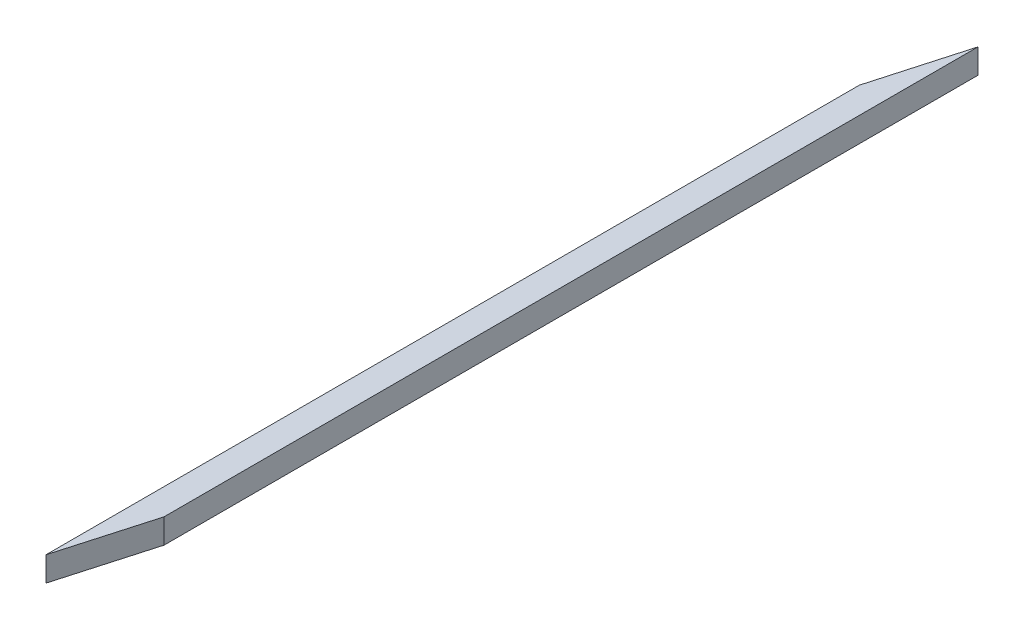
ISO-10303-21;
HEADER;
FILE_DESCRIPTION(('STEP AP214'),'2;1');
FILE_NAME('part.step','',(''),(''),'','','');
FILE_SCHEMA(('AUTOMOTIVE_DESIGN { 1 0 10303 214 1 1 1 1 }'));
ENDSEC;
DATA;
#1=APPLICATION_CONTEXT('core data for automotive mechanical design processes');
#2=APPLICATION_PROTOCOL_DEFINITION('international standard','automotive_design',2000,#1);
#3=PRODUCT_CONTEXT('',#1,'mechanical');
#4=PRODUCT('Part','Part','',(#3));
#5=PRODUCT_RELATED_PRODUCT_CATEGORY('part','',(#4));
#6=PRODUCT_DEFINITION_FORMATION('','',#4);
#7=PRODUCT_DEFINITION_CONTEXT('part definition',#1,'design');
#8=PRODUCT_DEFINITION('design','',#6,#7);
#9=PRODUCT_DEFINITION_SHAPE('','',#8);
#10=(LENGTH_UNIT() NAMED_UNIT(*) SI_UNIT(.MILLI.,.METRE.));
#11=(NAMED_UNIT(*) PLANE_ANGLE_UNIT() SI_UNIT($,.RADIAN.));
#12=(NAMED_UNIT(*) SI_UNIT($,.STERADIAN.) SOLID_ANGLE_UNIT());
#13=UNCERTAINTY_MEASURE_WITH_UNIT(LENGTH_MEASURE(1.E-05),#10,'distance_accuracy_value','');
#14=(GEOMETRIC_REPRESENTATION_CONTEXT(3) GLOBAL_UNCERTAINTY_ASSIGNED_CONTEXT((#13)) GLOBAL_UNIT_ASSIGNED_CONTEXT((#10,
#11,#12)) REPRESENTATION_CONTEXT('',''));
#15=CARTESIAN_POINT('',(0.,0.,0.));
#16=DIRECTION('',(0.,0.,1.));
#17=DIRECTION('',(1.,0.,0.));
#18=AXIS2_PLACEMENT_3D('',#15,#16,#17);
#19=CARTESIAN_POINT('',(1.875,2.65,1734.59));
#20=DIRECTION('',(-1.,0.,0.));
#21=DIRECTION('',(0.,-1.,0.));
#22=AXIS2_PLACEMENT_3D('',#19,#20,#21);
#23=PLANE('',#22);
#24=DIRECTION('',(0.,0.,-1.));
#25=VECTOR('',#24,1.);
#26=CARTESIAN_POINT('',(1.875,2.65,1734.59));
#27=LINE('',#26,#25);
#28=CARTESIAN_POINT('',(1.875,2.65,1555.93776164696));
#29=VERTEX_POINT('',#28);
#30=CARTESIAN_POINT('',(1.875,2.65,0.));
#31=VERTEX_POINT('',#30);
#32=EDGE_CURVE('E89',#29,#31,#27,.T.);
#33=ORIENTED_EDGE('',*,*,#32,.F.);
#34=DIRECTION('',(0.,-1.,0.));
#35=VECTOR('',#34,1.);
#36=CARTESIAN_POINT('',(1.875,2.65000000000008,1555.93776164696));
#37=LINE('',#36,#35);
#38=CARTESIAN_POINT('',(1.875,-44.35,1555.93776164696));
#39=VERTEX_POINT('',#38);
#40=EDGE_CURVE('E52',#29,#39,#37,.T.);
#41=ORIENTED_EDGE('',*,*,#40,.T.);
#42=DIRECTION('',(0.,0.,-1.));
#43=VECTOR('',#42,1.);
#44=CARTESIAN_POINT('',(1.875,-44.35,1734.59));
#45=LINE('',#44,#43);
#46=CARTESIAN_POINT('',(1.875,-44.35,0.));
#47=VERTEX_POINT('',#46);
#48=EDGE_CURVE('E45',#39,#47,#45,.T.);
#49=ORIENTED_EDGE('',*,*,#48,.T.);
#50=DIRECTION('',(0.,1.,0.));
#51=VECTOR('',#50,1.);
#52=CARTESIAN_POINT('',(1.875,2.65,0.));
#53=LINE('',#52,#51);
#54=EDGE_CURVE('E95',#47,#31,#53,.T.);
#55=ORIENTED_EDGE('',*,*,#54,.T.);
#56=EDGE_LOOP('',(#33,#41,#49,#55));
#57=FACE_BOUND('',#56,.T.);
#58=ADVANCED_FACE('F37',(#57),#23,.F.);
#59=CARTESIAN_POINT('',(-48.125,2.65,1734.59));
#60=DIRECTION('',(0.,-1.,0.));
#61=DIRECTION('',(0.,0.,-1.));
#62=AXIS2_PLACEMENT_3D('',#59,#60,#61);
#63=PLANE('',#62);
#64=ORIENTED_EDGE('',*,*,#32,.T.);
#65=DIRECTION('',(0.272146146579263,0.,-0.962255930042553));
#66=VECTOR('',#65,1.);
#67=CARTESIAN_POINT('',(-48.125,2.65,176.790291197875));
#68=LINE('',#67,#66);
#69=CARTESIAN_POINT('',(-48.125,2.65,176.790291197875));
#70=VERTEX_POINT('',#69);
#71=EDGE_CURVE('E60',#70,#31,#68,.T.);
#72=ORIENTED_EDGE('',*,*,#71,.F.);
#73=DIRECTION('',(0.,0.,-1.));
#74=VECTOR('',#73,1.);
#75=CARTESIAN_POINT('',(-48.125,2.65,1734.59));
#76=LINE('',#75,#74);
#77=CARTESIAN_POINT('',(-48.125,2.65,1731.58150031902));
#78=VERTEX_POINT('',#77);
#79=EDGE_CURVE('E87',#78,#70,#76,.T.);
#80=ORIENTED_EDGE('',*,*,#79,.F.);
#81=DIRECTION('',(-0.273789871613549,0.,0.961789533214953));
#82=VECTOR('',#81,1.);
#83=CARTESIAN_POINT('',(1.96565357155935,2.65,1555.6193070023));
#84=LINE('',#83,#82);
#85=EDGE_CURVE('E91',#29,#78,#84,.T.);
#86=ORIENTED_EDGE('',*,*,#85,.F.);
#87=EDGE_LOOP('',(#64,#72,#80,#86));
#88=FACE_BOUND('',#87,.T.);
#89=ADVANCED_FACE('F86',(#88),#63,.F.);
#90=CARTESIAN_POINT('',(-48.125,-44.35,1734.59));
#91=DIRECTION('',(0.,1.,0.));
#92=DIRECTION('',(0.,0.,1.));
#93=AXIS2_PLACEMENT_3D('',#90,#91,#92);
#94=PLANE('',#93);
#95=DIRECTION('',(0.,0.,-1.));
#96=VECTOR('',#95,1.);
#97=CARTESIAN_POINT('',(-48.125,-44.35,1734.59));
#98=LINE('',#97,#96);
#99=CARTESIAN_POINT('',(-48.125,-44.35,1731.58150031902));
#100=VERTEX_POINT('',#99);
#101=CARTESIAN_POINT('',(-48.125,-44.35,176.790291197875));
#102=VERTEX_POINT('',#101);
#103=EDGE_CURVE('E11',#100,#102,#98,.T.);
#104=ORIENTED_EDGE('',*,*,#103,.T.);
#105=DIRECTION('',(0.272146146579263,0.,-0.962255930042553));
#106=VECTOR('',#105,1.);
#107=CARTESIAN_POINT('',(-456.072620086568,-44.35,1619.21386216957));
#108=LINE('',#107,#106);
#109=EDGE_CURVE('E79',#102,#47,#108,.T.);
#110=ORIENTED_EDGE('',*,*,#109,.T.);
#111=ORIENTED_EDGE('',*,*,#48,.F.);
#112=DIRECTION('',(-0.273789871613549,0.,0.961789533214953));
#113=VECTOR('',#112,1.);
#114=CARTESIAN_POINT('',(-48.9172229044269,-44.35,1734.36448017492));
#115=LINE('',#114,#113);
#116=EDGE_CURVE('E106',#39,#100,#115,.T.);
#117=ORIENTED_EDGE('',*,*,#116,.T.);
#118=EDGE_LOOP('',(#104,#110,#111,#117));
#119=FACE_BOUND('',#118,.T.);
#120=ADVANCED_FACE('F105',(#119),#94,.F.);
#121=CARTESIAN_POINT('',(-48.125,2.65,1734.59));
#122=DIRECTION('',(1.,0.,0.));
#123=DIRECTION('',(0.,1.,0.));
#124=AXIS2_PLACEMENT_3D('',#121,#122,#123);
#125=PLANE('',#124);
#126=ORIENTED_EDGE('',*,*,#79,.T.);
#127=DIRECTION('',(0.,1.,0.));
#128=VECTOR('',#127,1.);
#129=CARTESIAN_POINT('',(-48.125,-47.35,176.790291197875));
#130=LINE('',#129,#128);
#131=EDGE_CURVE('E76',#102,#70,#130,.T.);
#132=ORIENTED_EDGE('',*,*,#131,.F.);
#133=ORIENTED_EDGE('',*,*,#103,.F.);
#134=DIRECTION('',(0.,1.,0.));
#135=VECTOR('',#134,1.);
#136=CARTESIAN_POINT('',(-48.125,2.65,1731.58150031902));
#137=LINE('',#136,#135);
#138=EDGE_CURVE('E94',#100,#78,#137,.T.);
#139=ORIENTED_EDGE('',*,*,#138,.T.);
#140=EDGE_LOOP('',(#126,#132,#133,#139));
#141=FACE_BOUND('',#140,.T.);
#142=ADVANCED_FACE('F39',(#141),#125,.F.);
#143=CARTESIAN_POINT('',(-48.125,-47.35,176.790291197875));
#144=DIRECTION('',(0.962255930042553,0.,0.272146146579263));
#145=DIRECTION('',(0.272146146579263,0.,-0.962255930042553));
#146=AXIS2_PLACEMENT_3D('',#143,#144,#145);
#147=PLANE('',#146);
#148=ORIENTED_EDGE('',*,*,#131,.T.);
#149=ORIENTED_EDGE('',*,*,#71,.T.);
#150=ORIENTED_EDGE('',*,*,#54,.F.);
#151=ORIENTED_EDGE('',*,*,#109,.F.);
#152=EDGE_LOOP('',(#148,#149,#150,#151));
#153=FACE_BOUND('',#152,.T.);
#154=ADVANCED_FACE('F77',(#153),#147,.F.);
#155=CARTESIAN_POINT('',(1.96565357155935,-47.35,1555.6193070023));
#156=DIRECTION('',(-0.961789533214953,0.,-0.273789871613549));
#157=DIRECTION('',(-0.273789871613549,0.,0.961789533214953));
#158=AXIS2_PLACEMENT_3D('',#155,#156,#157);
#159=PLANE('',#158);
#160=ORIENTED_EDGE('',*,*,#116,.F.);
#161=ORIENTED_EDGE('',*,*,#40,.F.);
#162=ORIENTED_EDGE('',*,*,#85,.T.);
#163=ORIENTED_EDGE('',*,*,#138,.F.);
#164=EDGE_LOOP('',(#160,#161,#162,#163));
#165=FACE_BOUND('',#164,.T.);
#166=ADVANCED_FACE('F111',(#165),#159,.F.);
#167=CLOSED_SHELL('',(#58,#89,#120,#142,#154,#166));
#168=MANIFOLD_SOLID_BREP('B2',#167);
#169=ADVANCED_BREP_SHAPE_REPRESENTATION('',(#18,#168),#14);
#170=SHAPE_DEFINITION_REPRESENTATION(#9,#169);
ENDSEC;
END-ISO-10303-21;
